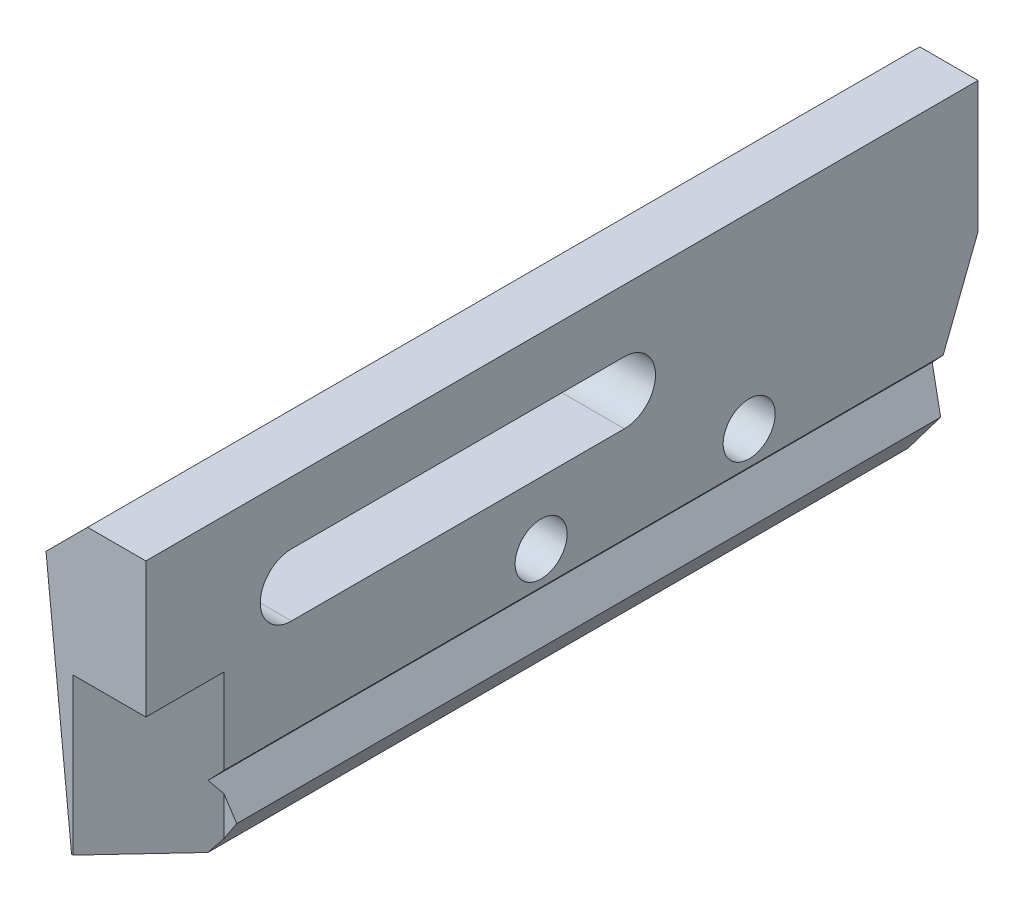
ISO-10303-21;
HEADER;
FILE_DESCRIPTION(('STEP AP214'),'2;1');
FILE_NAME('part.step','',(''),(''),'','','');
FILE_SCHEMA(('AUTOMOTIVE_DESIGN { 1 0 10303 214 1 1 1 1 }'));
ENDSEC;
DATA;
#1=APPLICATION_CONTEXT('core data for automotive mechanical design processes');
#2=APPLICATION_PROTOCOL_DEFINITION('international standard','automotive_design',2000,#1);
#3=PRODUCT_CONTEXT('',#1,'mechanical');
#4=PRODUCT('Part','Part','',(#3));
#5=PRODUCT_RELATED_PRODUCT_CATEGORY('part','',(#4));
#6=PRODUCT_DEFINITION_FORMATION('','',#4);
#7=PRODUCT_DEFINITION_CONTEXT('part definition',#1,'design');
#8=PRODUCT_DEFINITION('design','',#6,#7);
#9=PRODUCT_DEFINITION_SHAPE('','',#8);
#10=(LENGTH_UNIT() NAMED_UNIT(*) SI_UNIT(.MILLI.,.METRE.));
#11=(NAMED_UNIT(*) PLANE_ANGLE_UNIT() SI_UNIT($,.RADIAN.));
#12=(NAMED_UNIT(*) SI_UNIT($,.STERADIAN.) SOLID_ANGLE_UNIT());
#13=UNCERTAINTY_MEASURE_WITH_UNIT(LENGTH_MEASURE(1.E-05),#10,'distance_accuracy_value','');
#14=(GEOMETRIC_REPRESENTATION_CONTEXT(3) GLOBAL_UNCERTAINTY_ASSIGNED_CONTEXT((#13)) GLOBAL_UNIT_ASSIGNED_CONTEXT((#10,
#11,#12)) REPRESENTATION_CONTEXT('',''));
#15=CARTESIAN_POINT('',(0.,0.,0.));
#16=DIRECTION('',(0.,0.,1.));
#17=DIRECTION('',(1.,0.,0.));
#18=AXIS2_PLACEMENT_3D('',#15,#16,#17);
#19=CARTESIAN_POINT('',(5.42,-12.5,40.));
#20=DIRECTION('',(-0.834609406561725,0.550842208330739,0.));
#21=DIRECTION('',(-0.550842208330739,-0.834609406561725,0.));
#22=AXIS2_PLACEMENT_3D('',#19,#20,#21);
#23=PLANE('',#22);
#24=DIRECTION('',(-0.550842208330739,-0.834609406561725,0.));
#25=VECTOR('',#24,1.);
#26=CARTESIAN_POINT('',(5.42,-12.5,36.25));
#27=LINE('',#26,#25);
#28=CARTESIAN_POINT('',(5.42,-12.5,36.25));
#29=VERTEX_POINT('',#28);
#30=CARTESIAN_POINT('',(4.8,-13.4393939393939,36.25));
#31=VERTEX_POINT('',#30);
#32=EDGE_CURVE('E218',#29,#31,#27,.T.);
#33=ORIENTED_EDGE('',*,*,#32,.T.);
#34=DIRECTION('',(-0.474384406757119,-0.718764252662301,0.50826900723977));
#35=VECTOR('',#34,1.);
#36=CARTESIAN_POINT('',(4.35564997907154,-14.1126515468613,36.7260893081376));
#37=LINE('',#36,#35);
#38=CARTESIAN_POINT('',(4.43,-14.,36.6464285714286));
#39=VERTEX_POINT('',#38);
#40=EDGE_CURVE('E206',#31,#39,#37,.T.);
#41=ORIENTED_EDGE('',*,*,#40,.T.);
#42=DIRECTION('',(0.,0.,-1.));
#43=VECTOR('',#42,1.);
#44=CARTESIAN_POINT('',(4.43,-14.,40.));
#45=LINE('',#44,#43);
#46=CARTESIAN_POINT('',(4.43,-14.,3.));
#47=VERTEX_POINT('',#46);
#48=EDGE_CURVE('E252',#39,#47,#45,.T.);
#49=ORIENTED_EDGE('',*,*,#48,.T.);
#50=DIRECTION('',(0.523843138536813,0.793701725055777,-0.30923443833342));
#51=VECTOR('',#50,1.);
#52=CARTESIAN_POINT('',(-0.668312211122013,-21.724715471397,6.00962940444039));
#53=LINE('',#52,#51);
#54=CARTESIAN_POINT('',(5.42,-12.5,2.41558441558442));
#55=VERTEX_POINT('',#54);
#56=EDGE_CURVE('E236',#47,#55,#53,.T.);
#57=ORIENTED_EDGE('',*,*,#56,.T.);
#58=DIRECTION('',(0.,0.,-1.));
#59=VECTOR('',#58,1.);
#60=CARTESIAN_POINT('',(5.42,-12.5,40.));
#61=LINE('',#60,#59);
#62=EDGE_CURVE('E277',#29,#55,#61,.T.);
#63=ORIENTED_EDGE('',*,*,#62,.F.);
#64=EDGE_LOOP('',(#33,#41,#49,#57,#63));
#65=FACE_BOUND('',#64,.T.);
#66=ADVANCED_FACE('F32',(#65),#23,.F.);
#67=CARTESIAN_POINT('',(4.43,-11.,40.));
#68=DIRECTION('',(-0.834609406561725,-0.550842208330738,0.));
#69=DIRECTION('',(0.550842208330738,-0.834609406561726,0.));
#70=AXIS2_PLACEMENT_3D('',#67,#68,#69);
#71=PLANE('',#70);
#72=DIRECTION('',(0.,0.,-1.));
#73=VECTOR('',#72,1.);
#74=CARTESIAN_POINT('',(4.43,-11.,40.));
#75=LINE('',#74,#73);
#76=CARTESIAN_POINT('',(4.43,-11.,36.6464285714286));
#77=VERTEX_POINT('',#76);
#78=CARTESIAN_POINT('',(4.43,-11.,1.83116883116883));
#79=VERTEX_POINT('',#78);
#80=EDGE_CURVE('E275',#77,#79,#75,.T.);
#81=ORIENTED_EDGE('',*,*,#80,.F.);
#82=DIRECTION('',(0.474384406757118,-0.718764252662301,-0.508269007239769));
#83=VECTOR('',#82,1.);
#84=CARTESIAN_POINT('',(3.62140398895483,-9.77485452871944,37.5127814404055));
#85=LINE('',#84,#83);
#86=CARTESIAN_POINT('',(4.80000000000001,-11.5606060606061,36.25));
#87=VERTEX_POINT('',#86);
#88=EDGE_CURVE('E212',#77,#87,#85,.T.);
#89=ORIENTED_EDGE('',*,*,#88,.T.);
#90=DIRECTION('',(0.550842208330738,-0.834609406561726,0.));
#91=VECTOR('',#90,1.);
#92=CARTESIAN_POINT('',(4.43,-11.,36.25));
#93=LINE('',#92,#91);
#94=EDGE_CURVE('E215',#87,#29,#93,.T.);
#95=ORIENTED_EDGE('',*,*,#94,.T.);
#96=ORIENTED_EDGE('',*,*,#62,.T.);
#97=DIRECTION('',(-0.523843138536812,0.793701725055777,-0.30923443833342));
#98=VECTOR('',#97,1.);
#99=CARTESIAN_POINT('',(10.6129818895949,-20.3681543781741,5.48109910837952));
#100=LINE('',#99,#98);
#101=EDGE_CURVE('E233',#55,#79,#100,.T.);
#102=ORIENTED_EDGE('',*,*,#101,.T.);
#103=EDGE_LOOP('',(#81,#89,#95,#96,#102));
#104=FACE_BOUND('',#103,.T.);
#105=ADVANCED_FACE('F312',(#104),#71,.F.);
#106=CARTESIAN_POINT('',(4.43,-11.,40.));
#107=DIRECTION('',(-0.734099439586408,0.679041981617426,0.));
#108=DIRECTION('',(-0.679041981617427,-0.734099439586408,0.));
#109=AXIS2_PLACEMENT_3D('',#106,#107,#108);
#110=PLANE('',#109);
#111=DIRECTION('',(0.,0.,-1.));
#112=VECTOR('',#111,1.);
#113=CARTESIAN_POINT('',(4.8,-10.6,40.));
#114=LINE('',#113,#112);
#115=CARTESIAN_POINT('',(4.8,-10.6,36.25));
#116=VERTEX_POINT('',#115);
#117=CARTESIAN_POINT('',(4.8,-10.6,1.67532467532468));
#118=VERTEX_POINT('',#117);
#119=EDGE_CURVE('E273',#116,#118,#114,.T.);
#120=ORIENTED_EDGE('',*,*,#119,.F.);
#121=DIRECTION('',(-0.549094634555402,-0.593615821140976,0.588315679880788));
#122=VECTOR('',#121,1.);
#123=CARTESIAN_POINT('',(3.34665898832405,-12.1711794720821,37.8071510839385));
#124=LINE('',#123,#122);
#125=EDGE_CURVE('E209',#116,#77,#124,.T.);
#126=ORIENTED_EDGE('',*,*,#125,.T.);
#127=ORIENTED_EDGE('',*,*,#80,.T.);
#128=DIRECTION('',(0.652863627180529,0.705798515870844,-0.274986434754874));
#129=VECTOR('',#128,1.);
#130=CARTESIAN_POINT('',(-2.42239839667711,-18.407998266678,4.71740192208233));
#131=LINE('',#130,#129);
#132=EDGE_CURVE('E230',#79,#118,#131,.T.);
#133=ORIENTED_EDGE('',*,*,#132,.T.);
#134=EDGE_LOOP('',(#120,#126,#127,#133));
#135=FACE_BOUND('',#134,.T.);
#136=ADVANCED_FACE('F309',(#135),#110,.F.);
#137=CARTESIAN_POINT('',(4.8,0.,40.));
#138=DIRECTION('',(-1.,0.,0.));
#139=DIRECTION('',(0.,-1.,0.));
#140=AXIS2_PLACEMENT_3D('',#137,#138,#139);
#141=PLANE('',#140);
#142=DIRECTION('',(0.,0.,-1.));
#143=VECTOR('',#142,1.);
#144=CARTESIAN_POINT('',(4.8,-6.,33.));
#145=LINE('',#144,#143);
#146=CARTESIAN_POINT('',(4.8,-6.,33.));
#147=VERTEX_POINT('',#146);
#148=CARTESIAN_POINT('',(4.8,-6.,17.));
#149=VERTEX_POINT('',#148);
#150=EDGE_CURVE('E173',#147,#149,#145,.T.);
#151=ORIENTED_EDGE('',*,*,#150,.F.);
#152=CARTESIAN_POINT('',(4.8,-4.5,33.));
#153=DIRECTION('',(1.,0.,0.));
#154=DIRECTION('',(0.,1.,0.));
#155=AXIS2_PLACEMENT_3D('',#152,#153,#154);
#156=CIRCLE('',#155,1.5);
#157=CARTESIAN_POINT('',(4.8,-3.,33.));
#158=VERTEX_POINT('',#157);
#159=EDGE_CURVE('E46',#158,#147,#156,.T.);
#160=ORIENTED_EDGE('',*,*,#159,.F.);
#161=DIRECTION('',(0.,0.,1.));
#162=VECTOR('',#161,1.);
#163=CARTESIAN_POINT('',(4.8,-3.,33.));
#164=LINE('',#163,#162);
#165=CARTESIAN_POINT('',(4.8,-3.,17.));
#166=VERTEX_POINT('',#165);
#167=EDGE_CURVE('E164',#166,#158,#164,.T.);
#168=ORIENTED_EDGE('',*,*,#167,.F.);
#169=CARTESIAN_POINT('',(4.8,-4.5,17.));
#170=DIRECTION('',(1.,0.,0.));
#171=DIRECTION('',(0.,1.,0.));
#172=AXIS2_PLACEMENT_3D('',#169,#170,#171);
#173=CIRCLE('',#172,1.5);
#174=EDGE_CURVE('E167',#149,#166,#173,.T.);
#175=ORIENTED_EDGE('',*,*,#174,.F.);
#176=EDGE_LOOP('',(#151,#160,#168,#175));
#177=FACE_BOUND('',#176,.T.);
#178=CARTESIAN_POINT('',(4.8,-9.,11.));
#179=DIRECTION('',(1.,0.,0.));
#180=DIRECTION('',(0.,0.,-1.));
#181=AXIS2_PLACEMENT_3D('',#178,#179,#180);
#182=CIRCLE('',#181,1.25);
#183=CARTESIAN_POINT('',(4.8,-9.,9.75));
#184=VERTEX_POINT('',#183);
#185=EDGE_CURVE('E179',#184,#184,#182,.T.);
#186=ORIENTED_EDGE('',*,*,#185,.F.);
#187=EDGE_LOOP('',(#186));
#188=FACE_BOUND('',#187,.T.);
#189=CARTESIAN_POINT('',(4.8,-9.,21.));
#190=DIRECTION('',(1.,0.,0.));
#191=DIRECTION('',(0.,0.,-1.));
#192=AXIS2_PLACEMENT_3D('',#189,#190,#191);
#193=CIRCLE('',#192,1.25);
#194=CARTESIAN_POINT('',(4.8,-9.,19.75));
#195=VERTEX_POINT('',#194);
#196=EDGE_CURVE('E188',#195,#195,#193,.T.);
#197=ORIENTED_EDGE('',*,*,#196,.F.);
#198=EDGE_LOOP('',(#197));
#199=FACE_BOUND('',#198,.T.);
#200=DIRECTION('',(0.,0.,1.));
#201=VECTOR('',#200,1.);
#202=CARTESIAN_POINT('',(4.8,-6.5,40.));
#203=LINE('',#202,#201);
#204=CARTESIAN_POINT('',(4.8,-6.5,36.25));
#205=VERTEX_POINT('',#204);
#206=CARTESIAN_POINT('',(4.8,-6.5,40.));
#207=VERTEX_POINT('',#206);
#208=EDGE_CURVE('E54',#205,#207,#203,.T.);
#209=ORIENTED_EDGE('',*,*,#208,.F.);
#210=DIRECTION('',(0.,1.,0.));
#211=VECTOR('',#210,1.);
#212=CARTESIAN_POINT('',(4.8,-46.5,36.25));
#213=LINE('',#212,#211);
#214=EDGE_CURVE('E199',#116,#205,#213,.T.);
#215=ORIENTED_EDGE('',*,*,#214,.F.);
#216=ORIENTED_EDGE('',*,*,#119,.T.);
#217=DIRECTION('',(0.,0.93177739198532,-0.363030152721554));
#218=VECTOR('',#217,1.);
#219=CARTESIAN_POINT('',(4.8,-14.3608141748426,3.14057695123738));
#220=LINE('',#219,#218);
#221=CARTESIAN_POINT('',(4.8,-6.3,0.));
#222=VERTEX_POINT('',#221);
#223=EDGE_CURVE('E227',#118,#222,#220,.T.);
#224=ORIENTED_EDGE('',*,*,#223,.T.);
#225=DIRECTION('',(0.,1.,0.));
#226=VECTOR('',#225,1.);
#227=CARTESIAN_POINT('',(4.8,0.,0.));
#228=LINE('',#227,#226);
#229=CARTESIAN_POINT('',(4.8,0.,0.));
#230=VERTEX_POINT('',#229);
#231=EDGE_CURVE('E239',#222,#230,#228,.T.);
#232=ORIENTED_EDGE('',*,*,#231,.T.);
#233=DIRECTION('',(0.,0.,-1.));
#234=VECTOR('',#233,1.);
#235=CARTESIAN_POINT('',(4.8,0.,40.));
#236=LINE('',#235,#234);
#237=CARTESIAN_POINT('',(4.8,0.,40.));
#238=VERTEX_POINT('',#237);
#239=EDGE_CURVE('E270',#238,#230,#236,.T.);
#240=ORIENTED_EDGE('',*,*,#239,.F.);
#241=DIRECTION('',(0.,1.,0.));
#242=VECTOR('',#241,1.);
#243=CARTESIAN_POINT('',(4.8,0.,40.));
#244=LINE('',#243,#242);
#245=EDGE_CURVE('E240',#207,#238,#244,.T.);
#246=ORIENTED_EDGE('',*,*,#245,.F.);
#247=EDGE_LOOP('',(#209,#215,#216,#224,#232,#240,#246));
#248=FACE_BOUND('',#247,.T.);
#249=ADVANCED_FACE('F302',(#177,#188,#199,#248),#141,.F.);
#250=CARTESIAN_POINT('',(2.,0.,40.));
#251=DIRECTION('',(0.,-1.,0.));
#252=DIRECTION('',(0.,0.,-1.));
#253=AXIS2_PLACEMENT_3D('',#250,#251,#252);
#254=PLANE('',#253);
#255=DIRECTION('',(-1.,0.,0.));
#256=VECTOR('',#255,1.);
#257=CARTESIAN_POINT('',(2.,0.,0.));
#258=LINE('',#257,#256);
#259=CARTESIAN_POINT('',(2.,0.,0.));
#260=VERTEX_POINT('',#259);
#261=EDGE_CURVE('E254',#230,#260,#258,.T.);
#262=ORIENTED_EDGE('',*,*,#261,.T.);
#263=DIRECTION('',(0.,0.,-1.));
#264=VECTOR('',#263,1.);
#265=CARTESIAN_POINT('',(2.,0.,40.));
#266=LINE('',#265,#264);
#267=CARTESIAN_POINT('',(2.,0.,40.));
#268=VERTEX_POINT('',#267);
#269=EDGE_CURVE('E267',#268,#260,#266,.T.);
#270=ORIENTED_EDGE('',*,*,#269,.F.);
#271=DIRECTION('',(-1.,0.,0.));
#272=VECTOR('',#271,1.);
#273=CARTESIAN_POINT('',(2.,0.,40.));
#274=LINE('',#273,#272);
#275=EDGE_CURVE('E242',#238,#268,#274,.T.);
#276=ORIENTED_EDGE('',*,*,#275,.F.);
#277=ORIENTED_EDGE('',*,*,#239,.T.);
#278=EDGE_LOOP('',(#262,#270,#276,#277));
#279=FACE_BOUND('',#278,.T.);
#280=ADVANCED_FACE('F297',(#279),#254,.F.);
#281=CARTESIAN_POINT('',(0.,-2.,40.));
#282=DIRECTION('',(0.707106781186548,-0.707106781186548,0.));
#283=DIRECTION('',(0.707106781186548,0.707106781186548,0.));
#284=AXIS2_PLACEMENT_3D('',#281,#282,#283);
#285=PLANE('',#284);
#286=DIRECTION('',(-0.707106781186548,-0.707106781186548,0.));
#287=VECTOR('',#286,1.);
#288=CARTESIAN_POINT('',(0.,-2.,0.));
#289=LINE('',#288,#287);
#290=CARTESIAN_POINT('',(0.,-2.,0.));
#291=VERTEX_POINT('',#290);
#292=EDGE_CURVE('E256',#260,#291,#289,.T.);
#293=ORIENTED_EDGE('',*,*,#292,.T.);
#294=DIRECTION('',(0.,0.,-1.));
#295=VECTOR('',#294,1.);
#296=CARTESIAN_POINT('',(0.,-2.,40.));
#297=LINE('',#296,#295);
#298=CARTESIAN_POINT('',(0.,-2.,40.));
#299=VERTEX_POINT('',#298);
#300=EDGE_CURVE('E264',#299,#291,#297,.T.);
#301=ORIENTED_EDGE('',*,*,#300,.F.);
#302=DIRECTION('',(-0.707106781186548,-0.707106781186548,0.));
#303=VECTOR('',#302,1.);
#304=CARTESIAN_POINT('',(0.,-2.,40.));
#305=LINE('',#304,#303);
#306=EDGE_CURVE('E245',#268,#299,#305,.T.);
#307=ORIENTED_EDGE('',*,*,#306,.F.);
#308=ORIENTED_EDGE('',*,*,#269,.T.);
#309=EDGE_LOOP('',(#293,#301,#307,#308));
#310=FACE_BOUND('',#309,.T.);
#311=ADVANCED_FACE('F294',(#310),#285,.F.);
#312=CARTESIAN_POINT('',(0.,-2.,40.));
#313=DIRECTION('',(0.994787908879574,0.101965760660156,0.));
#314=DIRECTION('',(-0.101965760660156,0.994787908879574,0.));
#315=AXIS2_PLACEMENT_3D('',#312,#313,#314);
#316=PLANE('',#315);
#317=CARTESIAN_POINT('',(0.7175,-9.,11.));
#318=DIRECTION('',(0.994787908879574,0.101965760660156,0.));
#319=DIRECTION('',(0.101965760660156,-0.994787908879574,0.));
#320=AXIS2_PLACEMENT_3D('',#317,#318,#319);
#321=ELLIPSE('',#320,1.25654924918405,1.25);
#322=CARTESIAN_POINT('',(0.845625,-10.25,11.));
#323=VERTEX_POINT('',#322);
#324=EDGE_CURVE('E185',#323,#323,#321,.T.);
#325=ORIENTED_EDGE('',*,*,#324,.T.);
#326=EDGE_LOOP('',(#325));
#327=FACE_BOUND('',#326,.T.);
#328=CARTESIAN_POINT('',(0.7175,-9.,21.));
#329=DIRECTION('',(0.994787908879574,0.101965760660156,0.));
#330=DIRECTION('',(0.101965760660156,-0.994787908879574,0.));
#331=AXIS2_PLACEMENT_3D('',#328,#329,#330);
#332=ELLIPSE('',#331,1.25654924918405,1.25);
#333=CARTESIAN_POINT('',(0.845625,-10.25,21.));
#334=VERTEX_POINT('',#333);
#335=EDGE_CURVE('E191',#334,#334,#332,.T.);
#336=ORIENTED_EDGE('',*,*,#335,.T.);
#337=EDGE_LOOP('',(#336));
#338=FACE_BOUND('',#337,.T.);
#339=DIRECTION('',(0.101965760660156,-0.994787908879574,0.));
#340=VECTOR('',#339,1.);
#341=CARTESIAN_POINT('',(0.,-2.,0.));
#342=LINE('',#341,#340);
#343=CARTESIAN_POINT('',(0.440750000000001,-6.3,0.));
#344=VERTEX_POINT('',#343);
#345=EDGE_CURVE('E243',#291,#344,#342,.T.);
#346=ORIENTED_EDGE('',*,*,#345,.T.);
#347=DIRECTION('',(0.095074549966305,-0.927556585037122,0.361385682481996));
#348=VECTOR('',#347,1.);
#349=CARTESIAN_POINT('',(1.43190502381961,-15.9698051104352,3.76745653653318));
#350=LINE('',#349,#348);
#351=CARTESIAN_POINT('',(1.23,-14.,3.));
#352=VERTEX_POINT('',#351);
#353=EDGE_CURVE('E224',#344,#352,#350,.T.);
#354=ORIENTED_EDGE('',*,*,#353,.T.);
#355=DIRECTION('',(0.,0.,-1.));
#356=VECTOR('',#355,1.);
#357=CARTESIAN_POINT('',(1.23,-14.,40.));
#358=LINE('',#357,#356);
#359=CARTESIAN_POINT('',(1.23,-14.,40.));
#360=VERTEX_POINT('',#359);
#361=EDGE_CURVE('E261',#360,#352,#358,.T.);
#362=ORIENTED_EDGE('',*,*,#361,.F.);
#363=DIRECTION('',(0.101965760660156,-0.994787908879574,0.));
#364=VECTOR('',#363,1.);
#365=CARTESIAN_POINT('',(0.,-2.,40.));
#366=LINE('',#365,#364);
#367=EDGE_CURVE('E247',#299,#360,#366,.T.);
#368=ORIENTED_EDGE('',*,*,#367,.F.);
#369=ORIENTED_EDGE('',*,*,#300,.T.);
#370=EDGE_LOOP('',(#346,#354,#362,#368,#369));
#371=FACE_BOUND('',#370,.T.);
#372=ADVANCED_FACE('F288',(#327,#338,#371),#316,.F.);
#373=CARTESIAN_POINT('',(1.23,-14.,40.));
#374=DIRECTION('',(0.,1.,0.));
#375=DIRECTION('',(-1.,0.,0.));
#376=AXIS2_PLACEMENT_3D('',#373,#374,#375);
#377=PLANE('',#376);
#378=ORIENTED_EDGE('',*,*,#48,.F.);
#379=DIRECTION('',(-0.682318250360011,0.,0.731055268242869));
#380=VECTOR('',#379,1.);
#381=CARTESIAN_POINT('',(1.2674109263658,-14.,40.0349168646081));
#382=LINE('',#381,#380);
#383=CARTESIAN_POINT('',(1.3,-14.,40.));
#384=VERTEX_POINT('',#383);
#385=EDGE_CURVE('E203',#39,#384,#382,.T.);
#386=ORIENTED_EDGE('',*,*,#385,.T.);
#387=DIRECTION('',(1.,0.,0.));
#388=VECTOR('',#387,1.);
#389=CARTESIAN_POINT('',(1.23,-14.,40.));
#390=LINE('',#389,#388);
#391=EDGE_CURVE('E249',#360,#384,#390,.T.);
#392=ORIENTED_EDGE('',*,*,#391,.F.);
#393=ORIENTED_EDGE('',*,*,#361,.T.);
#394=DIRECTION('',(1.,0.,0.));
#395=VECTOR('',#394,1.);
#396=CARTESIAN_POINT('',(0.,-14.,3.));
#397=LINE('',#396,#395);
#398=EDGE_CURVE('E221',#352,#47,#397,.T.);
#399=ORIENTED_EDGE('',*,*,#398,.T.);
#400=EDGE_LOOP('',(#378,#386,#392,#393,#399));
#401=FACE_BOUND('',#400,.T.);
#402=ADVANCED_FACE('F318',(#401),#377,.F.);
#403=CARTESIAN_POINT('',(5.42,-12.5,40.));
#404=DIRECTION('',(0.,0.,1.));
#405=DIRECTION('',(1.,0.,0.));
#406=AXIS2_PLACEMENT_3D('',#403,#404,#405);
#407=PLANE('',#406);
#408=DIRECTION('',(0.,-1.,0.));
#409=VECTOR('',#408,1.);
#410=CARTESIAN_POINT('',(1.3,-12.5,40.));
#411=LINE('',#410,#409);
#412=CARTESIAN_POINT('',(1.3,-6.5,40.));
#413=VERTEX_POINT('',#412);
#414=EDGE_CURVE('E11',#413,#384,#411,.T.);
#415=ORIENTED_EDGE('',*,*,#414,.F.);
#416=DIRECTION('',(1.,0.,0.));
#417=VECTOR('',#416,1.);
#418=CARTESIAN_POINT('',(6.8,-6.5,40.));
#419=LINE('',#418,#417);
#420=EDGE_CURVE('E197',#413,#207,#419,.T.);
#421=ORIENTED_EDGE('',*,*,#420,.T.);
#422=ORIENTED_EDGE('',*,*,#245,.T.);
#423=ORIENTED_EDGE('',*,*,#275,.T.);
#424=ORIENTED_EDGE('',*,*,#306,.T.);
#425=ORIENTED_EDGE('',*,*,#367,.T.);
#426=ORIENTED_EDGE('',*,*,#391,.T.);
#427=EDGE_LOOP('',(#415,#421,#422,#423,#424,#425,#426));
#428=FACE_BOUND('',#427,.T.);
#429=ADVANCED_FACE('F322',(#428),#407,.T.);
#430=CARTESIAN_POINT('',(5.42,-12.5,0.));
#431=DIRECTION('',(0.,0.,1.));
#432=DIRECTION('',(1.,0.,0.));
#433=AXIS2_PLACEMENT_3D('',#430,#431,#432);
#434=PLANE('',#433);
#435=ORIENTED_EDGE('',*,*,#231,.F.);
#436=DIRECTION('',(-1.,0.,0.));
#437=VECTOR('',#436,1.);
#438=CARTESIAN_POINT('',(5.42,-6.3,0.));
#439=LINE('',#438,#437);
#440=EDGE_CURVE('E39',#222,#344,#439,.T.);
#441=ORIENTED_EDGE('',*,*,#440,.T.);
#442=ORIENTED_EDGE('',*,*,#345,.F.);
#443=ORIENTED_EDGE('',*,*,#292,.F.);
#444=ORIENTED_EDGE('',*,*,#261,.F.);
#445=EDGE_LOOP('',(#435,#441,#442,#443,#444));
#446=FACE_BOUND('',#445,.T.);
#447=ADVANCED_FACE('F282',(#446),#434,.F.);
#448=CARTESIAN_POINT('',(0.,-6.3,0.));
#449=DIRECTION('',(0.,0.363030152721554,0.93177739198532));
#450=DIRECTION('',(0.,-0.93177739198532,0.363030152721554));
#451=AXIS2_PLACEMENT_3D('',#448,#449,#450);
#452=PLANE('',#451);
#453=ORIENTED_EDGE('',*,*,#398,.F.);
#454=ORIENTED_EDGE('',*,*,#353,.F.);
#455=ORIENTED_EDGE('',*,*,#440,.F.);
#456=ORIENTED_EDGE('',*,*,#223,.F.);
#457=ORIENTED_EDGE('',*,*,#132,.F.);
#458=ORIENTED_EDGE('',*,*,#101,.F.);
#459=ORIENTED_EDGE('',*,*,#56,.F.);
#460=EDGE_LOOP('',(#453,#454,#455,#456,#457,#458,#459));
#461=FACE_BOUND('',#460,.T.);
#462=ADVANCED_FACE('F306',(#461),#452,.F.);
#463=CARTESIAN_POINT('',(4.8,-46.5,36.25));
#464=DIRECTION('',(0.,0.,-1.));
#465=DIRECTION('',(-1.,0.,0.));
#466=AXIS2_PLACEMENT_3D('',#463,#464,#465);
#467=PLANE('',#466);
#468=ORIENTED_EDGE('',*,*,#94,.F.);
#469=EDGE_CURVE('E201',#31,#87,#213,.T.);
#470=ORIENTED_EDGE('',*,*,#469,.F.);
#471=ORIENTED_EDGE('',*,*,#32,.F.);
#472=EDGE_LOOP('',(#468,#470,#471));
#473=FACE_BOUND('',#472,.T.);
#474=ADVANCED_FACE('F329',(#473),#467,.F.);
#475=CARTESIAN_POINT('',(1.3,-46.5,40.));
#476=DIRECTION('',(-0.731055268242869,0.,-0.682318250360011));
#477=DIRECTION('',(-0.682318250360011,0.,0.731055268242869));
#478=AXIS2_PLACEMENT_3D('',#475,#476,#477);
#479=PLANE('',#478);
#480=ORIENTED_EDGE('',*,*,#125,.F.);
#481=ORIENTED_EDGE('',*,*,#214,.T.);
#482=DIRECTION('',(-0.682318250360011,0.,0.731055268242869));
#483=VECTOR('',#482,1.);
#484=CARTESIAN_POINT('',(1.3,-6.5,40.));
#485=LINE('',#484,#483);
#486=EDGE_CURVE('E194',#205,#413,#485,.T.);
#487=ORIENTED_EDGE('',*,*,#486,.T.);
#488=ORIENTED_EDGE('',*,*,#414,.T.);
#489=ORIENTED_EDGE('',*,*,#385,.F.);
#490=ORIENTED_EDGE('',*,*,#40,.F.);
#491=ORIENTED_EDGE('',*,*,#469,.T.);
#492=ORIENTED_EDGE('',*,*,#88,.F.);
#493=EDGE_LOOP('',(#480,#481,#487,#488,#489,#490,#491,#492));
#494=FACE_BOUND('',#493,.T.);
#495=ADVANCED_FACE('F325',(#494),#479,.F.);
#496=CARTESIAN_POINT('',(4.8,-6.5,36.25));
#497=DIRECTION('',(0.,-1.,0.));
#498=DIRECTION('',(0.,0.,-1.));
#499=AXIS2_PLACEMENT_3D('',#496,#497,#498);
#500=PLANE('',#499);
#501=ORIENTED_EDGE('',*,*,#208,.T.);
#502=ORIENTED_EDGE('',*,*,#420,.F.);
#503=ORIENTED_EDGE('',*,*,#486,.F.);
#504=EDGE_LOOP('',(#501,#502,#503));
#505=FACE_BOUND('',#504,.T.);
#506=ADVANCED_FACE('F323',(#505),#500,.T.);
#507=CARTESIAN_POINT('',(4.8,-9.,21.));
#508=DIRECTION('',(1.,0.,0.));
#509=DIRECTION('',(0.,0.,-1.));
#510=AXIS2_PLACEMENT_3D('',#507,#508,#509);
#511=CYLINDRICAL_SURFACE('',#510,1.25);
#512=ORIENTED_EDGE('',*,*,#196,.T.);
#513=EDGE_LOOP('',(#512));
#514=FACE_BOUND('',#513,.T.);
#515=ORIENTED_EDGE('',*,*,#335,.F.);
#516=EDGE_LOOP('',(#515));
#517=FACE_BOUND('',#516,.T.);
#518=ADVANCED_FACE('F477',(#514,#517),#511,.F.);
#519=CARTESIAN_POINT('',(4.8,-9.,11.));
#520=DIRECTION('',(1.,0.,0.));
#521=DIRECTION('',(0.,0.,-1.));
#522=AXIS2_PLACEMENT_3D('',#519,#520,#521);
#523=CYLINDRICAL_SURFACE('',#522,1.25);
#524=ORIENTED_EDGE('',*,*,#185,.T.);
#525=EDGE_LOOP('',(#524));
#526=FACE_BOUND('',#525,.T.);
#527=ORIENTED_EDGE('',*,*,#324,.F.);
#528=EDGE_LOOP('',(#527));
#529=FACE_BOUND('',#528,.T.);
#530=ADVANCED_FACE('F427',(#526,#529),#523,.F.);
#531=CARTESIAN_POINT('',(1.2,-4.5,33.));
#532=DIRECTION('',(1.,0.,0.));
#533=DIRECTION('',(0.,1.,0.));
#534=AXIS2_PLACEMENT_3D('',#531,#532,#533);
#535=CYLINDRICAL_SURFACE('',#534,1.5);
#536=ORIENTED_EDGE('',*,*,#159,.T.);
#537=DIRECTION('',(1.,0.,0.));
#538=VECTOR('',#537,1.);
#539=CARTESIAN_POINT('',(1.2,-6.,33.));
#540=LINE('',#539,#538);
#541=CARTESIAN_POINT('',(1.2,-6.,33.));
#542=VERTEX_POINT('',#541);
#543=EDGE_CURVE('E142',#542,#147,#540,.T.);
#544=ORIENTED_EDGE('',*,*,#543,.F.);
#545=CARTESIAN_POINT('',(1.2,-4.5,33.));
#546=DIRECTION('',(1.,0.,0.));
#547=DIRECTION('',(0.,1.,0.));
#548=AXIS2_PLACEMENT_3D('',#545,#546,#547);
#549=CIRCLE('',#548,1.5);
#550=CARTESIAN_POINT('',(1.2,-3.,33.));
#551=VERTEX_POINT('',#550);
#552=EDGE_CURVE('E146',#551,#542,#549,.T.);
#553=ORIENTED_EDGE('',*,*,#552,.F.);
#554=DIRECTION('',(1.,0.,0.));
#555=VECTOR('',#554,1.);
#556=CARTESIAN_POINT('',(1.2,-3.,33.));
#557=LINE('',#556,#555);
#558=EDGE_CURVE('E177',#551,#158,#557,.T.);
#559=ORIENTED_EDGE('',*,*,#558,.T.);
#560=EDGE_LOOP('',(#536,#544,#553,#559));
#561=FACE_BOUND('',#560,.T.);
#562=ADVANCED_FACE('F144',(#561),#535,.F.);
#563=CARTESIAN_POINT('',(1.2,-3.,33.));
#564=DIRECTION('',(0.,1.,0.));
#565=DIRECTION('',(-1.,0.,0.));
#566=AXIS2_PLACEMENT_3D('',#563,#564,#565);
#567=PLANE('',#566);
#568=ORIENTED_EDGE('',*,*,#167,.T.);
#569=ORIENTED_EDGE('',*,*,#558,.F.);
#570=DIRECTION('',(0.,0.,1.));
#571=VECTOR('',#570,1.);
#572=CARTESIAN_POINT('',(1.2,-3.,33.));
#573=LINE('',#572,#571);
#574=CARTESIAN_POINT('',(1.2,-3.,17.));
#575=VERTEX_POINT('',#574);
#576=EDGE_CURVE('E152',#575,#551,#573,.T.);
#577=ORIENTED_EDGE('',*,*,#576,.F.);
#578=DIRECTION('',(1.,0.,0.));
#579=VECTOR('',#578,1.);
#580=CARTESIAN_POINT('',(1.2,-3.,17.));
#581=LINE('',#580,#579);
#582=EDGE_CURVE('E180',#575,#166,#581,.T.);
#583=ORIENTED_EDGE('',*,*,#582,.T.);
#584=EDGE_LOOP('',(#568,#569,#577,#583));
#585=FACE_BOUND('',#584,.T.);
#586=ADVANCED_FACE('F435',(#585),#567,.F.);
#587=CARTESIAN_POINT('',(1.2,-4.5,17.));
#588=DIRECTION('',(1.,0.,0.));
#589=DIRECTION('',(0.,1.,0.));
#590=AXIS2_PLACEMENT_3D('',#587,#588,#589);
#591=CYLINDRICAL_SURFACE('',#590,1.5);
#592=ORIENTED_EDGE('',*,*,#174,.T.);
#593=ORIENTED_EDGE('',*,*,#582,.F.);
#594=CARTESIAN_POINT('',(1.2,-4.5,17.));
#595=DIRECTION('',(1.,0.,0.));
#596=DIRECTION('',(0.,1.,0.));
#597=AXIS2_PLACEMENT_3D('',#594,#595,#596);
#598=CIRCLE('',#597,1.5);
#599=CARTESIAN_POINT('',(1.2,-6.,17.));
#600=VERTEX_POINT('',#599);
#601=EDGE_CURVE('E160',#600,#575,#598,.T.);
#602=ORIENTED_EDGE('',*,*,#601,.F.);
#603=DIRECTION('',(1.,0.,0.));
#604=VECTOR('',#603,1.);
#605=CARTESIAN_POINT('',(1.2,-6.,17.));
#606=LINE('',#605,#604);
#607=EDGE_CURVE('E151',#600,#149,#606,.T.);
#608=ORIENTED_EDGE('',*,*,#607,.T.);
#609=EDGE_LOOP('',(#592,#593,#602,#608));
#610=FACE_BOUND('',#609,.T.);
#611=ADVANCED_FACE('F445',(#610),#591,.F.);
#612=CARTESIAN_POINT('',(1.2,-6.,33.));
#613=DIRECTION('',(0.,-1.,0.));
#614=DIRECTION('',(1.,0.,0.));
#615=AXIS2_PLACEMENT_3D('',#612,#613,#614);
#616=PLANE('',#615);
#617=ORIENTED_EDGE('',*,*,#150,.T.);
#618=ORIENTED_EDGE('',*,*,#607,.F.);
#619=DIRECTION('',(0.,0.,-1.));
#620=VECTOR('',#619,1.);
#621=CARTESIAN_POINT('',(1.2,-6.,33.));
#622=LINE('',#621,#620);
#623=EDGE_CURVE('E155',#542,#600,#622,.T.);
#624=ORIENTED_EDGE('',*,*,#623,.F.);
#625=ORIENTED_EDGE('',*,*,#543,.T.);
#626=EDGE_LOOP('',(#617,#618,#624,#625));
#627=FACE_BOUND('',#626,.T.);
#628=ADVANCED_FACE('F156',(#627),#616,.F.);
#629=CARTESIAN_POINT('',(1.2,-4.5,33.));
#630=DIRECTION('',(1.,0.,0.));
#631=DIRECTION('',(0.,1.,0.));
#632=AXIS2_PLACEMENT_3D('',#629,#630,#631);
#633=PLANE('',#632);
#634=ORIENTED_EDGE('',*,*,#552,.T.);
#635=ORIENTED_EDGE('',*,*,#623,.T.);
#636=ORIENTED_EDGE('',*,*,#601,.T.);
#637=ORIENTED_EDGE('',*,*,#576,.T.);
#638=EDGE_LOOP('',(#634,#635,#636,#637));
#639=FACE_BOUND('',#638,.T.);
#640=ADVANCED_FACE('F162',(#639),#633,.T.);
#641=CLOSED_SHELL('',(#66,#105,#136,#249,#280,#311,#372,#402,#429,#447,#462,#474,#495,#506,#518,
#530,#562,#586,#611,#628,#640));
#642=MANIFOLD_SOLID_BREP('B2',#641);
#643=ADVANCED_BREP_SHAPE_REPRESENTATION('',(#18,#642),#14);
#644=SHAPE_DEFINITION_REPRESENTATION(#9,#643);
ENDSEC;
END-ISO-10303-21;
